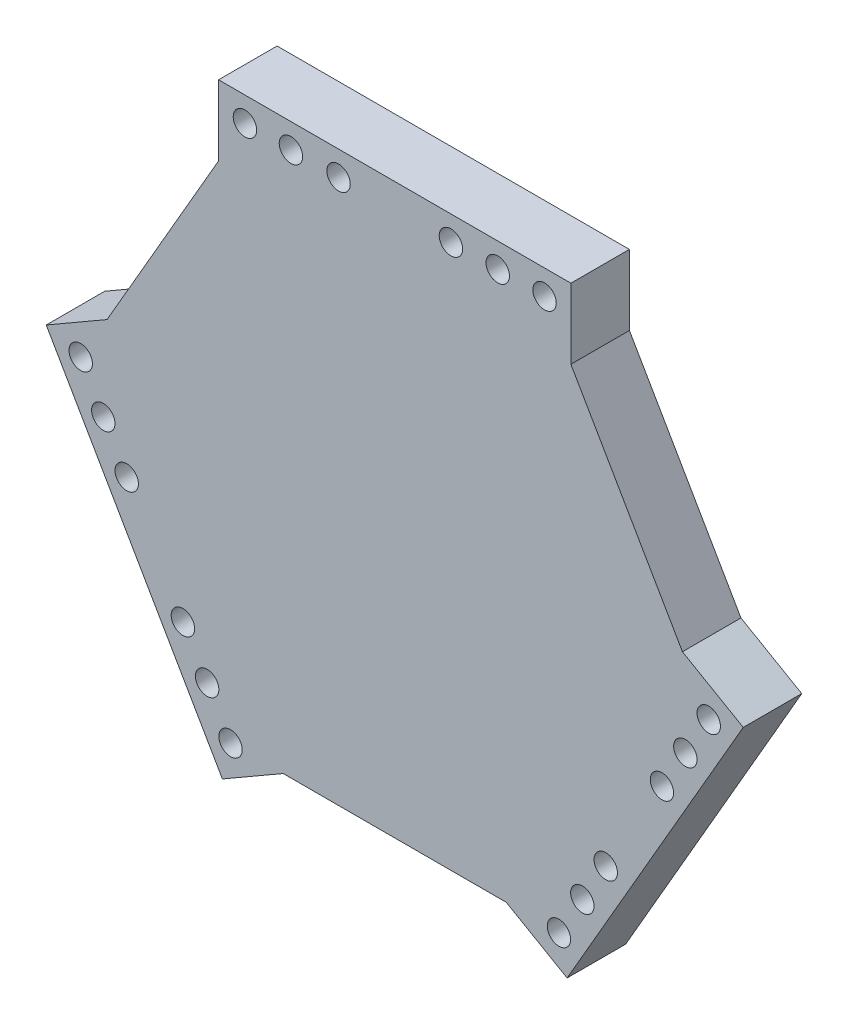
ISO-10303-21;
HEADER;
FILE_DESCRIPTION(('STEP AP214'),'2;1');
FILE_NAME('part.step','',(''),(''),'','','');
FILE_SCHEMA(('AUTOMOTIVE_DESIGN { 1 0 10303 214 1 1 1 1 }'));
ENDSEC;
DATA;
#1=APPLICATION_CONTEXT('core data for automotive mechanical design processes');
#2=APPLICATION_PROTOCOL_DEFINITION('international standard','automotive_design',2000,#1);
#3=PRODUCT_CONTEXT('',#1,'mechanical');
#4=PRODUCT('Part','Part','',(#3));
#5=PRODUCT_RELATED_PRODUCT_CATEGORY('part','',(#4));
#6=PRODUCT_DEFINITION_FORMATION('','',#4);
#7=PRODUCT_DEFINITION_CONTEXT('part definition',#1,'design');
#8=PRODUCT_DEFINITION('design','',#6,#7);
#9=PRODUCT_DEFINITION_SHAPE('','',#8);
#10=(LENGTH_UNIT() NAMED_UNIT(*) SI_UNIT(.MILLI.,.METRE.));
#11=(NAMED_UNIT(*) PLANE_ANGLE_UNIT() SI_UNIT($,.RADIAN.));
#12=(NAMED_UNIT(*) SI_UNIT($,.STERADIAN.) SOLID_ANGLE_UNIT());
#13=UNCERTAINTY_MEASURE_WITH_UNIT(LENGTH_MEASURE(1.E-05),#10,'distance_accuracy_value','');
#14=(GEOMETRIC_REPRESENTATION_CONTEXT(3) GLOBAL_UNCERTAINTY_ASSIGNED_CONTEXT((#13)) GLOBAL_UNIT_ASSIGNED_CONTEXT((#10,
#11,#12)) REPRESENTATION_CONTEXT('',''));
#15=CARTESIAN_POINT('',(0.,0.,0.));
#16=DIRECTION('',(0.,0.,1.));
#17=DIRECTION('',(1.,0.,0.));
#18=AXIS2_PLACEMENT_3D('',#15,#16,#17);
#19=CARTESIAN_POINT('',(14.1462590860232,24.502039474025,10.));
#20=DIRECTION('',(-0.500000000000001,-0.866025403784438,0.));
#21=DIRECTION('',(0.866025403784438,-0.500000000000001,0.));
#22=AXIS2_PLACEMENT_3D('',#19,#20,#21);
#23=PLANE('',#22);
#24=DIRECTION('',(-0.866025403784438,0.500000000000001,0.));
#25=VECTOR('',#24,1.);
#26=CARTESIAN_POINT('',(14.1462590860232,24.502039474025,0.));
#27=LINE('',#26,#25);
#28=CARTESIAN_POINT('',(79.2549746901522,-13.0884950066097,0.));
#29=VERTEX_POINT('',#28);
#30=CARTESIAN_POINT('',(68.862669844739,-7.08849500660971,0.));
#31=VERTEX_POINT('',#30);
#32=EDGE_CURVE('E209',#29,#31,#27,.T.);
#33=ORIENTED_EDGE('',*,*,#32,.T.);
#34=DIRECTION('',(0.,0.,-1.));
#35=VECTOR('',#34,1.);
#36=CARTESIAN_POINT('',(68.862669844739,-7.08849500660971,10.));
#37=LINE('',#36,#35);
#38=CARTESIAN_POINT('',(68.862669844739,-7.08849500660971,10.));
#39=VERTEX_POINT('',#38);
#40=EDGE_CURVE('E11',#39,#31,#37,.T.);
#41=ORIENTED_EDGE('',*,*,#40,.F.);
#42=DIRECTION('',(-0.866025403784438,0.500000000000001,0.));
#43=VECTOR('',#42,1.);
#44=CARTESIAN_POINT('',(14.1462590860232,24.502039474025,10.));
#45=LINE('',#44,#43);
#46=CARTESIAN_POINT('',(79.2549746901522,-13.0884950066097,10.));
#47=VERTEX_POINT('',#46);
#48=EDGE_CURVE('E320',#47,#39,#45,.T.);
#49=ORIENTED_EDGE('',*,*,#48,.F.);
#50=DIRECTION('',(0.,0.,-1.));
#51=VECTOR('',#50,1.);
#52=CARTESIAN_POINT('',(79.2549746901522,-13.0884950066097,10.));
#53=LINE('',#52,#51);
#54=EDGE_CURVE('E196',#47,#29,#53,.T.);
#55=ORIENTED_EDGE('',*,*,#54,.T.);
#56=EDGE_LOOP('',(#33,#41,#49,#55));
#57=FACE_BOUND('',#56,.T.);
#58=ADVANCED_FACE('F33',(#57),#23,.F.);
#59=CARTESIAN_POINT('',(48.5775940083924,28.04628697733,10.));
#60=DIRECTION('',(-0.866025403784436,-0.500000000000004,0.));
#61=DIRECTION('',(0.500000000000004,-0.866025403784436,0.));
#62=AXIS2_PLACEMENT_3D('',#59,#60,#61);
#63=PLANE('',#62);
#64=DIRECTION('',(-0.500000000000004,0.866025403784436,0.));
#65=VECTOR('',#64,1.);
#66=CARTESIAN_POINT('',(48.5775940083924,28.04628697733,0.));
#67=LINE('',#66,#65);
#68=CARTESIAN_POINT('',(49.8026698447388,25.924393385653,0.));
#69=VERTEX_POINT('',#68);
#70=EDGE_CURVE('E212',#31,#69,#67,.T.);
#71=ORIENTED_EDGE('',*,*,#70,.T.);
#72=DIRECTION('',(0.,0.,-1.));
#73=VECTOR('',#72,1.);
#74=CARTESIAN_POINT('',(49.8026698447388,25.924393385653,10.));
#75=LINE('',#74,#73);
#76=CARTESIAN_POINT('',(49.8026698447388,25.924393385653,10.));
#77=VERTEX_POINT('',#76);
#78=EDGE_CURVE('E42',#77,#69,#75,.T.);
#79=ORIENTED_EDGE('',*,*,#78,.F.);
#80=DIRECTION('',(-0.500000000000004,0.866025403784436,0.));
#81=VECTOR('',#80,1.);
#82=CARTESIAN_POINT('',(48.5775940083924,28.04628697733,10.));
#83=LINE('',#82,#81);
#84=EDGE_CURVE('E105',#39,#77,#83,.T.);
#85=ORIENTED_EDGE('',*,*,#84,.F.);
#86=ORIENTED_EDGE('',*,*,#40,.T.);
#87=EDGE_LOOP('',(#71,#79,#85,#86));
#88=FACE_BOUND('',#87,.T.);
#89=ADVANCED_FACE('F302',(#88),#63,.F.);
#90=CARTESIAN_POINT('',(49.8026698447388,0.,10.));
#91=DIRECTION('',(1.,0.,0.));
#92=DIRECTION('',(0.,0.,-1.));
#93=AXIS2_PLACEMENT_3D('',#90,#91,#92);
#94=PLANE('',#93);
#95=DIRECTION('',(0.,-1.,0.));
#96=VECTOR('',#95,1.);
#97=CARTESIAN_POINT('',(49.8026698447388,0.,0.));
#98=LINE('',#97,#96);
#99=CARTESIAN_POINT('',(49.8026698447388,37.924393385653,0.));
#100=VERTEX_POINT('',#99);
#101=EDGE_CURVE('E215',#100,#69,#98,.T.);
#102=ORIENTED_EDGE('',*,*,#101,.F.);
#103=DIRECTION('',(0.,0.,-1.));
#104=VECTOR('',#103,1.);
#105=CARTESIAN_POINT('',(49.8026698447388,37.924393385653,10.));
#106=LINE('',#105,#104);
#107=CARTESIAN_POINT('',(49.8026698447388,37.924393385653,10.));
#108=VERTEX_POINT('',#107);
#109=EDGE_CURVE('E295',#108,#100,#106,.T.);
#110=ORIENTED_EDGE('',*,*,#109,.F.);
#111=DIRECTION('',(0.,-1.,0.));
#112=VECTOR('',#111,1.);
#113=CARTESIAN_POINT('',(49.8026698447388,0.,10.));
#114=LINE('',#113,#112);
#115=EDGE_CURVE('E301',#108,#77,#114,.T.);
#116=ORIENTED_EDGE('',*,*,#115,.T.);
#117=ORIENTED_EDGE('',*,*,#78,.T.);
#118=EDGE_LOOP('',(#102,#110,#116,#117));
#119=FACE_BOUND('',#118,.T.);
#120=ADVANCED_FACE('F299',(#119),#94,.T.);
#121=CARTESIAN_POINT('',(0.,37.924393385653,10.));
#122=DIRECTION('',(0.,1.,0.));
#123=DIRECTION('',(0.,0.,1.));
#124=AXIS2_PLACEMENT_3D('',#121,#122,#123);
#125=PLANE('',#124);
#126=DIRECTION('',(1.,0.,0.));
#127=VECTOR('',#126,1.);
#128=CARTESIAN_POINT('',(0.,37.924393385653,0.));
#129=LINE('',#128,#127);
#130=CARTESIAN_POINT('',(-10.3973301552612,37.924393385653,0.));
#131=VERTEX_POINT('',#130);
#132=EDGE_CURVE('E218',#131,#100,#129,.T.);
#133=ORIENTED_EDGE('',*,*,#132,.F.);
#134=DIRECTION('',(0.,0.,-1.));
#135=VECTOR('',#134,1.);
#136=CARTESIAN_POINT('',(-10.3973301552612,37.924393385653,10.));
#137=LINE('',#136,#135);
#138=CARTESIAN_POINT('',(-10.3973301552612,37.924393385653,10.));
#139=VERTEX_POINT('',#138);
#140=EDGE_CURVE('E293',#139,#131,#137,.T.);
#141=ORIENTED_EDGE('',*,*,#140,.F.);
#142=DIRECTION('',(1.,0.,0.));
#143=VECTOR('',#142,1.);
#144=CARTESIAN_POINT('',(0.,37.924393385653,10.));
#145=LINE('',#144,#143);
#146=EDGE_CURVE('E316',#139,#108,#145,.T.);
#147=ORIENTED_EDGE('',*,*,#146,.T.);
#148=ORIENTED_EDGE('',*,*,#109,.T.);
#149=EDGE_LOOP('',(#133,#141,#147,#148));
#150=FACE_BOUND('',#149,.T.);
#151=ADVANCED_FACE('F312',(#150),#125,.T.);
#152=CARTESIAN_POINT('',(-10.3973301552612,0.,10.));
#153=DIRECTION('',(1.,0.,0.));
#154=DIRECTION('',(0.,1.,0.));
#155=AXIS2_PLACEMENT_3D('',#152,#153,#154);
#156=PLANE('',#155);
#157=DIRECTION('',(0.,-1.,0.));
#158=VECTOR('',#157,1.);
#159=CARTESIAN_POINT('',(-10.3973301552612,0.,0.));
#160=LINE('',#159,#158);
#161=CARTESIAN_POINT('',(-10.3973301552612,25.9243933856528,0.));
#162=VERTEX_POINT('',#161);
#163=EDGE_CURVE('E221',#131,#162,#160,.T.);
#164=ORIENTED_EDGE('',*,*,#163,.T.);
#165=DIRECTION('',(0.,0.,-1.));
#166=VECTOR('',#165,1.);
#167=CARTESIAN_POINT('',(-10.3973301552612,25.9243933856528,10.));
#168=LINE('',#167,#166);
#169=CARTESIAN_POINT('',(-10.3973301552612,25.9243933856528,10.));
#170=VERTEX_POINT('',#169);
#171=EDGE_CURVE('E290',#170,#162,#168,.T.);
#172=ORIENTED_EDGE('',*,*,#171,.F.);
#173=DIRECTION('',(0.,-1.,0.));
#174=VECTOR('',#173,1.);
#175=CARTESIAN_POINT('',(-10.3973301552612,0.,10.));
#176=LINE('',#175,#174);
#177=EDGE_CURVE('E318',#139,#170,#176,.T.);
#178=ORIENTED_EDGE('',*,*,#177,.F.);
#179=ORIENTED_EDGE('',*,*,#140,.T.);
#180=EDGE_LOOP('',(#164,#172,#178,#179));
#181=FACE_BOUND('',#180,.T.);
#182=ADVANCED_FACE('F704',(#181),#156,.F.);
#183=CARTESIAN_POINT('',(-19.0235892412842,10.9832743694082,10.));
#184=DIRECTION('',(0.86602540378444,-0.499999999999998,0.));
#185=DIRECTION('',(0.499999999999998,0.86602540378444,0.));
#186=AXIS2_PLACEMENT_3D('',#183,#184,#185);
#187=PLANE('',#186);
#188=DIRECTION('',(-0.499999999999998,-0.86602540378444,0.));
#189=VECTOR('',#188,1.);
#190=CARTESIAN_POINT('',(-19.0235892412842,10.9832743694082,0.));
#191=LINE('',#190,#189);
#192=CARTESIAN_POINT('',(-29.457330155261,-7.08849500660985,0.));
#193=VERTEX_POINT('',#192);
#194=EDGE_CURVE('E223',#162,#193,#191,.T.);
#195=ORIENTED_EDGE('',*,*,#194,.T.);
#196=DIRECTION('',(0.,0.,-1.));
#197=VECTOR('',#196,1.);
#198=CARTESIAN_POINT('',(-29.457330155261,-7.08849500660985,10.));
#199=LINE('',#198,#197);
#200=CARTESIAN_POINT('',(-29.457330155261,-7.08849500660985,10.));
#201=VERTEX_POINT('',#200);
#202=EDGE_CURVE('E288',#201,#193,#199,.T.);
#203=ORIENTED_EDGE('',*,*,#202,.F.);
#204=DIRECTION('',(-0.499999999999998,-0.86602540378444,0.));
#205=VECTOR('',#204,1.);
#206=CARTESIAN_POINT('',(-19.0235892412842,10.9832743694082,10.));
#207=LINE('',#206,#205);
#208=EDGE_CURVE('E325',#170,#201,#207,.T.);
#209=ORIENTED_EDGE('',*,*,#208,.F.);
#210=ORIENTED_EDGE('',*,*,#171,.T.);
#211=EDGE_LOOP('',(#195,#203,#209,#210));
#212=FACE_BOUND('',#211,.T.);
#213=ADVANCED_FACE('F695',(#212),#187,.F.);
#214=CARTESIAN_POINT('',(-4.29492416365385,7.43902686610355,10.));
#215=DIRECTION('',(-0.500000000000009,0.866025403784433,0.));
#216=DIRECTION('',(-0.866025403784433,-0.500000000000009,0.));
#217=AXIS2_PLACEMENT_3D('',#214,#215,#216);
#218=PLANE('',#217);
#219=DIRECTION('',(0.866025403784433,0.500000000000009,0.));
#220=VECTOR('',#219,1.);
#221=CARTESIAN_POINT('',(-4.29492416365385,7.43902686610355,0.));
#222=LINE('',#221,#220);
#223=CARTESIAN_POINT('',(-39.8496350006742,-13.08849500661,0.));
#224=VERTEX_POINT('',#223);
#225=EDGE_CURVE('E226',#224,#193,#222,.T.);
#226=ORIENTED_EDGE('',*,*,#225,.F.);
#227=DIRECTION('',(0.,0.,-1.));
#228=VECTOR('',#227,1.);
#229=CARTESIAN_POINT('',(-39.8496350006742,-13.08849500661,10.));
#230=LINE('',#229,#228);
#231=CARTESIAN_POINT('',(-39.8496350006742,-13.08849500661,10.));
#232=VERTEX_POINT('',#231);
#233=EDGE_CURVE('E286',#232,#224,#230,.T.);
#234=ORIENTED_EDGE('',*,*,#233,.F.);
#235=DIRECTION('',(0.866025403784433,0.500000000000009,0.));
#236=VECTOR('',#235,1.);
#237=CARTESIAN_POINT('',(-4.29492416365385,7.43902686610355,10.));
#238=LINE('',#237,#236);
#239=EDGE_CURVE('E327',#232,#201,#238,.T.);
#240=ORIENTED_EDGE('',*,*,#239,.T.);
#241=ORIENTED_EDGE('',*,*,#202,.T.);
#242=EDGE_LOOP('',(#226,#234,#240,#241));
#243=FACE_BOUND('',#242,.T.);
#244=ADVANCED_FACE('F686',(#243),#218,.T.);
#245=CARTESIAN_POINT('',(-35.5547108370204,-20.5275218727134,10.));
#246=DIRECTION('',(-0.866025403784434,-0.500000000000007,0.));
#247=DIRECTION('',(0.500000000000007,-0.866025403784435,0.));
#248=AXIS2_PLACEMENT_3D('',#245,#246,#247);
#249=PLANE('',#248);
#250=DIRECTION('',(-0.500000000000007,0.866025403784435,0.));
#251=VECTOR('',#250,1.);
#252=CARTESIAN_POINT('',(-35.5547108370204,-20.5275218727134,0.));
#253=LINE('',#252,#251);
#254=CARTESIAN_POINT('',(-9.74963500067373,-65.223224314433,0.));
#255=VERTEX_POINT('',#254);
#256=EDGE_CURVE('E229',#255,#224,#253,.T.);
#257=ORIENTED_EDGE('',*,*,#256,.F.);
#258=DIRECTION('',(0.,0.,-1.));
#259=VECTOR('',#258,1.);
#260=CARTESIAN_POINT('',(-9.74963500067373,-65.223224314433,10.));
#261=LINE('',#260,#259);
#262=CARTESIAN_POINT('',(-9.74963500067373,-65.223224314433,10.));
#263=VERTEX_POINT('',#262);
#264=EDGE_CURVE('E284',#263,#255,#261,.T.);
#265=ORIENTED_EDGE('',*,*,#264,.F.);
#266=DIRECTION('',(-0.500000000000007,0.866025403784435,0.));
#267=VECTOR('',#266,1.);
#268=CARTESIAN_POINT('',(-35.5547108370204,-20.5275218727134,10.));
#269=LINE('',#268,#267);
#270=EDGE_CURVE('E330',#263,#232,#269,.T.);
#271=ORIENTED_EDGE('',*,*,#270,.T.);
#272=ORIENTED_EDGE('',*,*,#233,.T.);
#273=EDGE_LOOP('',(#257,#265,#271,#272));
#274=FACE_BOUND('',#273,.T.);
#275=ADVANCED_FACE('F678',(#274),#249,.T.);
#276=CARTESIAN_POINT('',(25.8050758363467,-44.6957024417195,10.));
#277=DIRECTION('',(0.500000000000007,-0.866025403784435,0.));
#278=DIRECTION('',(0.866025403784435,0.500000000000007,0.));
#279=AXIS2_PLACEMENT_3D('',#276,#277,#278);
#280=PLANE('',#279);
#281=DIRECTION('',(-0.866025403784435,-0.500000000000007,0.));
#282=VECTOR('',#281,1.);
#283=CARTESIAN_POINT('',(25.8050758363467,-44.6957024417195,0.));
#284=LINE('',#283,#282);
#285=CARTESIAN_POINT('',(0.642669844739498,-59.2232243144329,0.));
#286=VERTEX_POINT('',#285);
#287=EDGE_CURVE('E232',#286,#255,#284,.T.);
#288=ORIENTED_EDGE('',*,*,#287,.F.);
#289=DIRECTION('',(0.,0.,-1.));
#290=VECTOR('',#289,1.);
#291=CARTESIAN_POINT('',(0.642669844739498,-59.2232243144329,10.));
#292=LINE('',#291,#290);
#293=CARTESIAN_POINT('',(0.642669844739498,-59.2232243144329,10.));
#294=VERTEX_POINT('',#293);
#295=EDGE_CURVE('E146',#294,#286,#292,.T.);
#296=ORIENTED_EDGE('',*,*,#295,.F.);
#297=DIRECTION('',(-0.866025403784435,-0.500000000000007,0.));
#298=VECTOR('',#297,1.);
#299=CARTESIAN_POINT('',(25.8050758363467,-44.6957024417195,10.));
#300=LINE('',#299,#298);
#301=EDGE_CURVE('E139',#294,#263,#300,.T.);
#302=ORIENTED_EDGE('',*,*,#301,.T.);
#303=ORIENTED_EDGE('',*,*,#264,.T.);
#304=EDGE_LOOP('',(#288,#296,#302,#303));
#305=FACE_BOUND('',#304,.T.);
#306=ADVANCED_FACE('F334',(#305),#280,.T.);
#307=CARTESIAN_POINT('',(0.,-59.2232243144329,10.));
#308=DIRECTION('',(0.,1.,0.));
#309=DIRECTION('',(0.,0.,1.));
#310=AXIS2_PLACEMENT_3D('',#307,#308,#309);
#311=PLANE('',#310);
#312=DIRECTION('',(1.,0.,0.));
#313=VECTOR('',#312,1.);
#314=CARTESIAN_POINT('',(0.,-59.2232243144329,0.));
#315=LINE('',#314,#313);
#316=CARTESIAN_POINT('',(38.7626698447389,-59.2232243144329,0.));
#317=VERTEX_POINT('',#316);
#318=EDGE_CURVE('E145',#286,#317,#315,.T.);
#319=ORIENTED_EDGE('',*,*,#318,.T.);
#320=DIRECTION('',(0.,0.,-1.));
#321=VECTOR('',#320,1.);
#322=CARTESIAN_POINT('',(38.7626698447389,-59.2232243144329,10.));
#323=LINE('',#322,#321);
#324=CARTESIAN_POINT('',(38.7626698447389,-59.2232243144329,10.));
#325=VERTEX_POINT('',#324);
#326=EDGE_CURVE('E142',#325,#317,#323,.T.);
#327=ORIENTED_EDGE('',*,*,#326,.F.);
#328=DIRECTION('',(1.,0.,0.));
#329=VECTOR('',#328,1.);
#330=CARTESIAN_POINT('',(0.,-59.2232243144329,10.));
#331=LINE('',#330,#329);
#332=EDGE_CURVE('E131',#294,#325,#331,.T.);
#333=ORIENTED_EDGE('',*,*,#332,.F.);
#334=ORIENTED_EDGE('',*,*,#295,.T.);
#335=EDGE_LOOP('',(#319,#327,#333,#334));
#336=FACE_BOUND('',#335,.T.);
#337=ADVANCED_FACE('F143',(#336),#311,.F.);
#338=CARTESIAN_POINT('',(-15.9537409139768,-27.6326898337981,10.));
#339=DIRECTION('',(0.500000000000001,0.866025403784438,0.));
#340=DIRECTION('',(-0.866025403784438,0.500000000000001,0.));
#341=AXIS2_PLACEMENT_3D('',#338,#339,#340);
#342=PLANE('',#341);
#343=DIRECTION('',(0.866025403784438,-0.500000000000001,0.));
#344=VECTOR('',#343,1.);
#345=CARTESIAN_POINT('',(-15.9537409139768,-27.6326898337981,0.));
#346=LINE('',#345,#344);
#347=CARTESIAN_POINT('',(49.1549746901523,-65.223224314433,0.));
#348=VERTEX_POINT('',#347);
#349=EDGE_CURVE('E91',#317,#348,#346,.T.);
#350=ORIENTED_EDGE('',*,*,#349,.T.);
#351=DIRECTION('',(0.,0.,-1.));
#352=VECTOR('',#351,1.);
#353=CARTESIAN_POINT('',(49.1549746901523,-65.223224314433,10.));
#354=LINE('',#353,#352);
#355=CARTESIAN_POINT('',(49.1549746901523,-65.223224314433,10.));
#356=VERTEX_POINT('',#355);
#357=EDGE_CURVE('E147',#356,#348,#354,.T.);
#358=ORIENTED_EDGE('',*,*,#357,.F.);
#359=DIRECTION('',(0.866025403784438,-0.500000000000001,0.));
#360=VECTOR('',#359,1.);
#361=CARTESIAN_POINT('',(-15.9537409139768,-27.6326898337981,10.));
#362=LINE('',#361,#360);
#363=EDGE_CURVE('E136',#325,#356,#362,.T.);
#364=ORIENTED_EDGE('',*,*,#363,.F.);
#365=ORIENTED_EDGE('',*,*,#326,.T.);
#366=EDGE_LOOP('',(#350,#358,#364,#365));
#367=FACE_BOUND('',#366,.T.);
#368=ADVANCED_FACE('F149',(#367),#342,.F.);
#369=CARTESIAN_POINT('',(-12.3573301552616,-52.2950210841579,10.));
#370=DIRECTION('',(0.,0.,-1.));
#371=DIRECTION('',(-1.,0.,0.));
#372=AXIS2_PLACEMENT_3D('',#369,#370,#371);
#373=CYLINDRICAL_SURFACE('',#372,2.00000000000076);
#374=CARTESIAN_POINT('',(-12.3573301552616,-52.2950210841579,10.));
#375=DIRECTION('',(0.,0.,1.));
#376=DIRECTION('',(1.,0.,0.));
#377=AXIS2_PLACEMENT_3D('',#374,#375,#376);
#378=CIRCLE('',#377,2.00000000000076);
#379=CARTESIAN_POINT('',(-10.3573301552608,-52.2950210841579,10.));
#380=VERTEX_POINT('',#379);
#381=EDGE_CURVE('E190',#380,#380,#378,.T.);
#382=ORIENTED_EDGE('',*,*,#381,.T.);
#383=EDGE_LOOP('',(#382));
#384=FACE_BOUND('',#383,.T.);
#385=CARTESIAN_POINT('',(-12.3573301552616,-52.2950210841579,0.));
#386=DIRECTION('',(0.,0.,1.));
#387=DIRECTION('',(1.,0.,0.));
#388=AXIS2_PLACEMENT_3D('',#385,#386,#387);
#389=CIRCLE('',#388,2.00000000000076);
#390=CARTESIAN_POINT('',(-10.3573301552608,-52.2950210841579,0.));
#391=VERTEX_POINT('',#390);
#392=EDGE_CURVE('E274',#391,#391,#389,.T.);
#393=ORIENTED_EDGE('',*,*,#392,.F.);
#394=EDGE_LOOP('',(#393));
#395=FACE_BOUND('',#394,.T.);
#396=ADVANCED_FACE('F396',(#384,#395),#373,.F.);
#397=CARTESIAN_POINT('',(-16.4976707976515,-45.3668178538819,10.));
#398=DIRECTION('',(0.,0.,-1.));
#399=DIRECTION('',(-1.,0.,0.));
#400=AXIS2_PLACEMENT_3D('',#397,#398,#399);
#401=CYLINDRICAL_SURFACE('',#400,2.);
#402=CARTESIAN_POINT('',(-16.4976707976515,-45.3668178538819,10.));
#403=DIRECTION('',(0.,0.,1.));
#404=DIRECTION('',(1.,0.,0.));
#405=AXIS2_PLACEMENT_3D('',#402,#403,#404);
#406=CIRCLE('',#405,2.);
#407=CARTESIAN_POINT('',(-14.4976707976515,-45.3668178538819,10.));
#408=VERTEX_POINT('',#407);
#409=EDGE_CURVE('E187',#408,#408,#406,.T.);
#410=ORIENTED_EDGE('',*,*,#409,.T.);
#411=EDGE_LOOP('',(#410));
#412=FACE_BOUND('',#411,.T.);
#413=CARTESIAN_POINT('',(-16.4976707976515,-45.3668178538819,0.));
#414=DIRECTION('',(0.,0.,1.));
#415=DIRECTION('',(1.,0.,0.));
#416=AXIS2_PLACEMENT_3D('',#413,#414,#415);
#417=CIRCLE('',#416,2.);
#418=CARTESIAN_POINT('',(-14.4976707976515,-45.3668178538819,0.));
#419=VERTEX_POINT('',#418);
#420=EDGE_CURVE('E271',#419,#419,#417,.T.);
#421=ORIENTED_EDGE('',*,*,#420,.F.);
#422=EDGE_LOOP('',(#421));
#423=FACE_BOUND('',#422,.T.);
#424=ADVANCED_FACE('F399',(#412,#423),#401,.F.);
#425=CARTESIAN_POINT('',(-26.0976707976517,-28.7391301012208,10.));
#426=DIRECTION('',(0.,0.,-1.));
#427=DIRECTION('',(-1.,0.,0.));
#428=AXIS2_PLACEMENT_3D('',#425,#426,#427);
#429=CYLINDRICAL_SURFACE('',#428,2.);
#430=CARTESIAN_POINT('',(-26.0976707976517,-28.7391301012208,10.));
#431=DIRECTION('',(0.,0.,1.));
#432=DIRECTION('',(1.,0.,0.));
#433=AXIS2_PLACEMENT_3D('',#430,#431,#432);
#434=CIRCLE('',#433,2.);
#435=CARTESIAN_POINT('',(-24.0976707976517,-28.7391301012208,10.));
#436=VERTEX_POINT('',#435);
#437=EDGE_CURVE('E184',#436,#436,#434,.T.);
#438=ORIENTED_EDGE('',*,*,#437,.T.);
#439=EDGE_LOOP('',(#438));
#440=FACE_BOUND('',#439,.T.);
#441=CARTESIAN_POINT('',(-26.0976707976517,-28.7391301012208,0.));
#442=DIRECTION('',(0.,0.,1.));
#443=DIRECTION('',(1.,0.,0.));
#444=AXIS2_PLACEMENT_3D('',#441,#442,#443);
#445=CIRCLE('',#444,2.);
#446=CARTESIAN_POINT('',(-24.0976707976517,-28.7391301012208,0.));
#447=VERTEX_POINT('',#446);
#448=EDGE_CURVE('E268',#447,#447,#445,.T.);
#449=ORIENTED_EDGE('',*,*,#448,.F.);
#450=EDGE_LOOP('',(#449));
#451=FACE_BOUND('',#450,.T.);
#452=ADVANCED_FACE('F403',(#440,#451),#429,.F.);
#453=CARTESIAN_POINT('',(-30.0976707976518,-21.8109268709454,10.));
#454=DIRECTION('',(0.,0.,-1.));
#455=DIRECTION('',(-1.,0.,0.));
#456=AXIS2_PLACEMENT_3D('',#453,#454,#455);
#457=CYLINDRICAL_SURFACE('',#456,2.);
#458=CARTESIAN_POINT('',(-30.0976707976518,-21.8109268709454,10.));
#459=DIRECTION('',(0.,0.,1.));
#460=DIRECTION('',(1.,0.,0.));
#461=AXIS2_PLACEMENT_3D('',#458,#459,#460);
#462=CIRCLE('',#461,2.);
#463=CARTESIAN_POINT('',(-28.0976707976518,-21.8109268709454,10.));
#464=VERTEX_POINT('',#463);
#465=EDGE_CURVE('E181',#464,#464,#462,.T.);
#466=ORIENTED_EDGE('',*,*,#465,.T.);
#467=EDGE_LOOP('',(#466));
#468=FACE_BOUND('',#467,.T.);
#469=CARTESIAN_POINT('',(-30.0976707976518,-21.8109268709454,0.));
#470=DIRECTION('',(0.,0.,1.));
#471=DIRECTION('',(1.,0.,0.));
#472=AXIS2_PLACEMENT_3D('',#469,#470,#471);
#473=CIRCLE('',#472,2.);
#474=CARTESIAN_POINT('',(-28.0976707976518,-21.8109268709454,0.));
#475=VERTEX_POINT('',#474);
#476=EDGE_CURVE('E265',#475,#475,#473,.T.);
#477=ORIENTED_EDGE('',*,*,#476,.F.);
#478=EDGE_LOOP('',(#477));
#479=FACE_BOUND('',#478,.T.);
#480=ADVANCED_FACE('F407',(#468,#479),#457,.F.);
#481=CARTESIAN_POINT('',(-33.9573301552611,-14.8827236406699,10.));
#482=DIRECTION('',(0.,0.,-1.));
#483=DIRECTION('',(-1.,0.,0.));
#484=AXIS2_PLACEMENT_3D('',#481,#482,#483);
#485=CYLINDRICAL_SURFACE('',#484,2.);
#486=CARTESIAN_POINT('',(-33.9573301552611,-14.8827236406699,10.));
#487=DIRECTION('',(0.,0.,1.));
#488=DIRECTION('',(1.,0.,0.));
#489=AXIS2_PLACEMENT_3D('',#486,#487,#488);
#490=CIRCLE('',#489,2.);
#491=CARTESIAN_POINT('',(-31.9573301552611,-14.8827236406699,10.));
#492=VERTEX_POINT('',#491);
#493=EDGE_CURVE('E178',#492,#492,#490,.T.);
#494=ORIENTED_EDGE('',*,*,#493,.T.);
#495=EDGE_LOOP('',(#494));
#496=FACE_BOUND('',#495,.T.);
#497=CARTESIAN_POINT('',(-33.9573301552611,-14.8827236406699,0.));
#498=DIRECTION('',(0.,0.,1.));
#499=DIRECTION('',(1.,0.,0.));
#500=AXIS2_PLACEMENT_3D('',#497,#498,#499);
#501=CIRCLE('',#500,2.);
#502=CARTESIAN_POINT('',(-31.9573301552611,-14.8827236406699,0.));
#503=VERTEX_POINT('',#502);
#504=EDGE_CURVE('E262',#503,#503,#501,.T.);
#505=ORIENTED_EDGE('',*,*,#504,.F.);
#506=EDGE_LOOP('',(#505));
#507=FACE_BOUND('',#506,.T.);
#508=ADVANCED_FACE('F411',(#496,#507),#485,.F.);
#509=CARTESIAN_POINT('',(45.3026698447388,33.7186220197128,10.));
#510=DIRECTION('',(0.,0.,-1.));
#511=DIRECTION('',(-1.,0.,0.));
#512=AXIS2_PLACEMENT_3D('',#509,#510,#511);
#513=CYLINDRICAL_SURFACE('',#512,2.);
#514=CARTESIAN_POINT('',(45.3026698447388,33.7186220197128,10.));
#515=DIRECTION('',(0.,0.,1.));
#516=DIRECTION('',(1.,0.,0.));
#517=AXIS2_PLACEMENT_3D('',#514,#515,#516);
#518=CIRCLE('',#517,2.);
#519=CARTESIAN_POINT('',(47.3026698447388,33.7186220197128,10.));
#520=VERTEX_POINT('',#519);
#521=EDGE_CURVE('E175',#520,#520,#518,.T.);
#522=ORIENTED_EDGE('',*,*,#521,.T.);
#523=EDGE_LOOP('',(#522));
#524=FACE_BOUND('',#523,.T.);
#525=CARTESIAN_POINT('',(45.3026698447388,33.7186220197128,0.));
#526=DIRECTION('',(0.,0.,1.));
#527=DIRECTION('',(1.,0.,0.));
#528=AXIS2_PLACEMENT_3D('',#525,#526,#527);
#529=CIRCLE('',#528,2.);
#530=CARTESIAN_POINT('',(47.3026698447388,33.7186220197128,0.));
#531=VERTEX_POINT('',#530);
#532=EDGE_CURVE('E259',#531,#531,#529,.T.);
#533=ORIENTED_EDGE('',*,*,#532,.F.);
#534=EDGE_LOOP('',(#533));
#535=FACE_BOUND('',#534,.T.);
#536=ADVANCED_FACE('F415',(#524,#535),#513,.F.);
#537=CARTESIAN_POINT('',(51.7626698447392,-52.2950210841575,10.));
#538=DIRECTION('',(0.,0.,-1.));
#539=DIRECTION('',(-1.,0.,0.));
#540=AXIS2_PLACEMENT_3D('',#537,#538,#539);
#541=CYLINDRICAL_SURFACE('',#540,2.);
#542=CARTESIAN_POINT('',(51.7626698447392,-52.2950210841575,10.));
#543=DIRECTION('',(0.,0.,1.));
#544=DIRECTION('',(1.,0.,0.));
#545=AXIS2_PLACEMENT_3D('',#542,#543,#544);
#546=CIRCLE('',#545,2.);
#547=CARTESIAN_POINT('',(53.7626698447392,-52.2950210841575,10.));
#548=VERTEX_POINT('',#547);
#549=EDGE_CURVE('E172',#548,#548,#546,.T.);
#550=ORIENTED_EDGE('',*,*,#549,.T.);
#551=EDGE_LOOP('',(#550));
#552=FACE_BOUND('',#551,.T.);
#553=CARTESIAN_POINT('',(51.7626698447392,-52.2950210841575,0.));
#554=DIRECTION('',(0.,0.,1.));
#555=DIRECTION('',(1.,0.,0.));
#556=AXIS2_PLACEMENT_3D('',#553,#554,#555);
#557=CIRCLE('',#556,2.);
#558=CARTESIAN_POINT('',(53.7626698447392,-52.2950210841575,0.));
#559=VERTEX_POINT('',#558);
#560=EDGE_CURVE('E256',#559,#559,#557,.T.);
#561=ORIENTED_EDGE('',*,*,#560,.F.);
#562=EDGE_LOOP('',(#561));
#563=FACE_BOUND('',#562,.T.);
#564=ADVANCED_FACE('F419',(#552,#563),#541,.F.);
#565=CARTESIAN_POINT('',(-5.89733015526116,33.7186220197128,10.));
#566=DIRECTION('',(0.,0.,-1.));
#567=DIRECTION('',(-1.,0.,0.));
#568=AXIS2_PLACEMENT_3D('',#565,#566,#567);
#569=CYLINDRICAL_SURFACE('',#568,2.);
#570=CARTESIAN_POINT('',(-5.89733015526116,33.7186220197128,10.));
#571=DIRECTION('',(0.,0.,1.));
#572=DIRECTION('',(1.,0.,0.));
#573=AXIS2_PLACEMENT_3D('',#570,#571,#572);
#574=CIRCLE('',#573,2.);
#575=CARTESIAN_POINT('',(-3.89733015526116,33.7186220197128,10.));
#576=VERTEX_POINT('',#575);
#577=EDGE_CURVE('E169',#576,#576,#574,.T.);
#578=ORIENTED_EDGE('',*,*,#577,.T.);
#579=EDGE_LOOP('',(#578));
#580=FACE_BOUND('',#579,.T.);
#581=CARTESIAN_POINT('',(-5.89733015526116,33.7186220197128,0.));
#582=DIRECTION('',(0.,0.,1.));
#583=DIRECTION('',(1.,0.,0.));
#584=AXIS2_PLACEMENT_3D('',#581,#582,#583);
#585=CIRCLE('',#584,2.);
#586=CARTESIAN_POINT('',(-3.89733015526116,33.7186220197128,0.));
#587=VERTEX_POINT('',#586);
#588=EDGE_CURVE('E253',#587,#587,#585,.T.);
#589=ORIENTED_EDGE('',*,*,#588,.F.);
#590=EDGE_LOOP('',(#589));
#591=FACE_BOUND('',#590,.T.);
#592=ADVANCED_FACE('F423',(#580,#591),#569,.F.);
#593=CARTESIAN_POINT('',(1.96232920234802,33.7186220197129,10.));
#594=DIRECTION('',(0.,0.,-1.));
#595=DIRECTION('',(-1.,0.,0.));
#596=AXIS2_PLACEMENT_3D('',#593,#594,#595);
#597=CYLINDRICAL_SURFACE('',#596,2.);
#598=CARTESIAN_POINT('',(1.96232920234802,33.7186220197129,10.));
#599=DIRECTION('',(0.,0.,1.));
#600=DIRECTION('',(1.,0.,0.));
#601=AXIS2_PLACEMENT_3D('',#598,#599,#600);
#602=CIRCLE('',#601,2.);
#603=CARTESIAN_POINT('',(3.96232920234802,33.7186220197129,10.));
#604=VERTEX_POINT('',#603);
#605=EDGE_CURVE('E166',#604,#604,#602,.T.);
#606=ORIENTED_EDGE('',*,*,#605,.T.);
#607=EDGE_LOOP('',(#606));
#608=FACE_BOUND('',#607,.T.);
#609=CARTESIAN_POINT('',(1.96232920234802,33.7186220197129,0.));
#610=DIRECTION('',(0.,0.,1.));
#611=DIRECTION('',(1.,0.,0.));
#612=AXIS2_PLACEMENT_3D('',#609,#610,#611);
#613=CIRCLE('',#612,2.);
#614=CARTESIAN_POINT('',(3.96232920234802,33.7186220197129,0.));
#615=VERTEX_POINT('',#614);
#616=EDGE_CURVE('E250',#615,#615,#613,.T.);
#617=ORIENTED_EDGE('',*,*,#616,.F.);
#618=EDGE_LOOP('',(#617));
#619=FACE_BOUND('',#618,.T.);
#620=ADVANCED_FACE('F427',(#608,#619),#597,.F.);
#621=CARTESIAN_POINT('',(10.1026698447388,33.7186220197128,10.));
#622=DIRECTION('',(0.,0.,-1.));
#623=DIRECTION('',(-1.,0.,0.));
#624=AXIS2_PLACEMENT_3D('',#621,#622,#623);
#625=CYLINDRICAL_SURFACE('',#624,2.);
#626=CARTESIAN_POINT('',(10.1026698447388,33.7186220197128,10.));
#627=DIRECTION('',(0.,0.,1.));
#628=DIRECTION('',(1.,0.,0.));
#629=AXIS2_PLACEMENT_3D('',#626,#627,#628);
#630=CIRCLE('',#629,2.);
#631=CARTESIAN_POINT('',(12.1026698447388,33.7186220197128,10.));
#632=VERTEX_POINT('',#631);
#633=EDGE_CURVE('E163',#632,#632,#630,.T.);
#634=ORIENTED_EDGE('',*,*,#633,.T.);
#635=EDGE_LOOP('',(#634));
#636=FACE_BOUND('',#635,.T.);
#637=CARTESIAN_POINT('',(10.1026698447388,33.7186220197128,0.));
#638=DIRECTION('',(0.,0.,1.));
#639=DIRECTION('',(1.,0.,0.));
#640=AXIS2_PLACEMENT_3D('',#637,#638,#639);
#641=CIRCLE('',#640,2.);
#642=CARTESIAN_POINT('',(12.1026698447388,33.7186220197128,0.));
#643=VERTEX_POINT('',#642);
#644=EDGE_CURVE('E247',#643,#643,#641,.T.);
#645=ORIENTED_EDGE('',*,*,#644,.F.);
#646=EDGE_LOOP('',(#645));
#647=FACE_BOUND('',#646,.T.);
#648=ADVANCED_FACE('F431',(#636,#647),#625,.F.);
#649=CARTESIAN_POINT('',(29.3026698447388,33.7186220197128,10.));
#650=DIRECTION('',(0.,0.,-1.));
#651=DIRECTION('',(-1.,0.,0.));
#652=AXIS2_PLACEMENT_3D('',#649,#650,#651);
#653=CYLINDRICAL_SURFACE('',#652,2.);
#654=CARTESIAN_POINT('',(29.3026698447388,33.7186220197128,10.));
#655=DIRECTION('',(0.,0.,1.));
#656=DIRECTION('',(1.,0.,0.));
#657=AXIS2_PLACEMENT_3D('',#654,#655,#656);
#658=CIRCLE('',#657,2.);
#659=CARTESIAN_POINT('',(31.3026698447388,33.7186220197128,10.));
#660=VERTEX_POINT('',#659);
#661=EDGE_CURVE('E160',#660,#660,#658,.T.);
#662=ORIENTED_EDGE('',*,*,#661,.T.);
#663=EDGE_LOOP('',(#662));
#664=FACE_BOUND('',#663,.T.);
#665=CARTESIAN_POINT('',(29.3026698447388,33.7186220197128,0.));
#666=DIRECTION('',(0.,0.,1.));
#667=DIRECTION('',(1.,0.,0.));
#668=AXIS2_PLACEMENT_3D('',#665,#666,#667);
#669=CIRCLE('',#668,2.);
#670=CARTESIAN_POINT('',(31.3026698447388,33.7186220197128,0.));
#671=VERTEX_POINT('',#670);
#672=EDGE_CURVE('E244',#671,#671,#669,.T.);
#673=ORIENTED_EDGE('',*,*,#672,.F.);
#674=EDGE_LOOP('',(#673));
#675=FACE_BOUND('',#674,.T.);
#676=ADVANCED_FACE('F435',(#664,#675),#653,.F.);
#677=CARTESIAN_POINT('',(37.3026698447388,33.7186220197128,10.));
#678=DIRECTION('',(0.,0.,-1.));
#679=DIRECTION('',(-1.,0.,0.));
#680=AXIS2_PLACEMENT_3D('',#677,#678,#679);
#681=CYLINDRICAL_SURFACE('',#680,2.);
#682=CARTESIAN_POINT('',(37.3026698447388,33.7186220197128,10.));
#683=DIRECTION('',(0.,0.,1.));
#684=DIRECTION('',(1.,0.,0.));
#685=AXIS2_PLACEMENT_3D('',#682,#683,#684);
#686=CIRCLE('',#685,2.);
#687=CARTESIAN_POINT('',(39.3026698447388,33.7186220197128,10.));
#688=VERTEX_POINT('',#687);
#689=EDGE_CURVE('E157',#688,#688,#686,.T.);
#690=ORIENTED_EDGE('',*,*,#689,.T.);
#691=EDGE_LOOP('',(#690));
#692=FACE_BOUND('',#691,.T.);
#693=CARTESIAN_POINT('',(37.3026698447388,33.7186220197128,0.));
#694=DIRECTION('',(0.,0.,1.));
#695=DIRECTION('',(1.,0.,0.));
#696=AXIS2_PLACEMENT_3D('',#693,#694,#695);
#697=CIRCLE('',#696,2.);
#698=CARTESIAN_POINT('',(39.3026698447388,33.7186220197128,0.));
#699=VERTEX_POINT('',#698);
#700=EDGE_CURVE('E241',#699,#699,#697,.T.);
#701=ORIENTED_EDGE('',*,*,#700,.F.);
#702=EDGE_LOOP('',(#701));
#703=FACE_BOUND('',#702,.T.);
#704=ADVANCED_FACE('F350',(#692,#703),#681,.F.);
#705=CARTESIAN_POINT('',(47.7626698447393,-59.2232243144329,10.));
#706=DIRECTION('',(0.,0.,-1.));
#707=DIRECTION('',(-1.,0.,0.));
#708=AXIS2_PLACEMENT_3D('',#705,#706,#707);
#709=CYLINDRICAL_SURFACE('',#708,2.00000000000008);
#710=CARTESIAN_POINT('',(47.7626698447393,-59.2232243144329,10.));
#711=DIRECTION('',(0.,0.,1.));
#712=DIRECTION('',(1.,0.,0.));
#713=AXIS2_PLACEMENT_3D('',#710,#711,#712);
#714=CIRCLE('',#713,2.00000000000008);
#715=CARTESIAN_POINT('',(49.7626698447393,-59.2232243144329,10.));
#716=VERTEX_POINT('',#715);
#717=EDGE_CURVE('E151',#716,#716,#714,.T.);
#718=ORIENTED_EDGE('',*,*,#717,.T.);
#719=EDGE_LOOP('',(#718));
#720=FACE_BOUND('',#719,.T.);
#721=CARTESIAN_POINT('',(47.7626698447393,-59.2232243144329,0.));
#722=DIRECTION('',(0.,0.,1.));
#723=DIRECTION('',(1.,0.,0.));
#724=AXIS2_PLACEMENT_3D('',#721,#722,#723);
#725=CIRCLE('',#724,2.00000000000008);
#726=CARTESIAN_POINT('',(49.7626698447393,-59.2232243144329,0.));
#727=VERTEX_POINT('',#726);
#728=EDGE_CURVE('E238',#727,#727,#725,.T.);
#729=ORIENTED_EDGE('',*,*,#728,.F.);
#730=EDGE_LOOP('',(#729));
#731=FACE_BOUND('',#730,.T.);
#732=ADVANCED_FACE('F341',(#720,#731),#709,.F.);
#733=CARTESIAN_POINT('',(65.1087156041292,-37.5905344806346,10.));
#734=DIRECTION('',(-0.86602540378444,0.499999999999998,0.));
#735=DIRECTION('',(-0.499999999999998,-0.86602540378444,0.));
#736=AXIS2_PLACEMENT_3D('',#733,#734,#735);
#737=PLANE('',#736);
#738=DIRECTION('',(0.499999999999998,0.86602540378444,0.));
#739=VECTOR('',#738,1.);
#740=CARTESIAN_POINT('',(65.1087156041292,-37.5905344806346,0.));
#741=LINE('',#740,#739);
#742=EDGE_CURVE('E97',#348,#29,#741,.T.);
#743=ORIENTED_EDGE('',*,*,#742,.T.);
#744=ORIENTED_EDGE('',*,*,#54,.F.);
#745=DIRECTION('',(0.499999999999998,0.86602540378444,0.));
#746=VECTOR('',#745,1.);
#747=CARTESIAN_POINT('',(65.1087156041292,-37.5905344806346,10.));
#748=LINE('',#747,#746);
#749=EDGE_CURVE('E50',#356,#47,#748,.T.);
#750=ORIENTED_EDGE('',*,*,#749,.F.);
#751=ORIENTED_EDGE('',*,*,#357,.T.);
#752=EDGE_LOOP('',(#743,#744,#750,#751));
#753=FACE_BOUND('',#752,.T.);
#754=ADVANCED_FACE('F338',(#753),#737,.F.);
#755=CARTESIAN_POINT('',(73.3626698447391,-14.8827236406697,10.));
#756=DIRECTION('',(0.,0.,-1.));
#757=DIRECTION('',(-1.,0.,0.));
#758=AXIS2_PLACEMENT_3D('',#755,#756,#757);
#759=CYLINDRICAL_SURFACE('',#758,1.99999999999998);
#760=CARTESIAN_POINT('',(73.3626698447391,-14.8827236406697,10.));
#761=DIRECTION('',(0.,0.,1.));
#762=DIRECTION('',(1.,0.,0.));
#763=AXIS2_PLACEMENT_3D('',#760,#761,#762);
#764=CIRCLE('',#763,1.99999999999998);
#765=CARTESIAN_POINT('',(75.362669844739,-14.8827236406697,10.));
#766=VERTEX_POINT('',#765);
#767=EDGE_CURVE('E777',#766,#766,#764,.T.);
#768=ORIENTED_EDGE('',*,*,#767,.T.);
#769=EDGE_LOOP('',(#768));
#770=FACE_BOUND('',#769,.T.);
#771=CARTESIAN_POINT('',(73.3626698447391,-14.8827236406697,0.));
#772=DIRECTION('',(0.,0.,1.));
#773=DIRECTION('',(1.,0.,0.));
#774=AXIS2_PLACEMENT_3D('',#771,#772,#773);
#775=CIRCLE('',#774,1.99999999999998);
#776=CARTESIAN_POINT('',(75.362669844739,-14.8827236406697,0.));
#777=VERTEX_POINT('',#776);
#778=EDGE_CURVE('E206',#777,#777,#775,.T.);
#779=ORIENTED_EDGE('',*,*,#778,.F.);
#780=EDGE_LOOP('',(#779));
#781=FACE_BOUND('',#780,.T.);
#782=ADVANCED_FACE('F340',(#770,#781),#759,.F.);
#783=CARTESIAN_POINT('',(69.3626698447391,-21.8109268709453,10.));
#784=DIRECTION('',(0.,0.,-1.));
#785=DIRECTION('',(-1.,0.,0.));
#786=AXIS2_PLACEMENT_3D('',#783,#784,#785);
#787=CYLINDRICAL_SURFACE('',#786,2.);
#788=CARTESIAN_POINT('',(69.3626698447391,-21.8109268709453,10.));
#789=DIRECTION('',(0.,0.,1.));
#790=DIRECTION('',(1.,0.,0.));
#791=AXIS2_PLACEMENT_3D('',#788,#789,#790);
#792=CIRCLE('',#791,2.);
#793=CARTESIAN_POINT('',(71.3626698447391,-21.8109268709453,10.));
#794=VERTEX_POINT('',#793);
#795=EDGE_CURVE('E774',#794,#794,#792,.T.);
#796=ORIENTED_EDGE('',*,*,#795,.T.);
#797=EDGE_LOOP('',(#796));
#798=FACE_BOUND('',#797,.T.);
#799=CARTESIAN_POINT('',(69.3626698447391,-21.8109268709453,0.));
#800=DIRECTION('',(0.,0.,1.));
#801=DIRECTION('',(1.,0.,0.));
#802=AXIS2_PLACEMENT_3D('',#799,#800,#801);
#803=CIRCLE('',#802,2.);
#804=CARTESIAN_POINT('',(71.3626698447391,-21.8109268709453,0.));
#805=VERTEX_POINT('',#804);
#806=EDGE_CURVE('E203',#805,#805,#803,.T.);
#807=ORIENTED_EDGE('',*,*,#806,.F.);
#808=EDGE_LOOP('',(#807));
#809=FACE_BOUND('',#808,.T.);
#810=ADVANCED_FACE('F347',(#798,#809),#787,.F.);
#811=CARTESIAN_POINT('',(65.3626698447392,-28.7391301012208,10.));
#812=DIRECTION('',(0.,0.,-1.));
#813=DIRECTION('',(-1.,0.,0.));
#814=AXIS2_PLACEMENT_3D('',#811,#812,#813);
#815=CYLINDRICAL_SURFACE('',#814,2.);
#816=CARTESIAN_POINT('',(65.3626698447392,-28.7391301012208,10.));
#817=DIRECTION('',(0.,0.,1.));
#818=DIRECTION('',(1.,0.,0.));
#819=AXIS2_PLACEMENT_3D('',#816,#817,#818);
#820=CIRCLE('',#819,2.);
#821=CARTESIAN_POINT('',(67.3626698447392,-28.7391301012208,10.));
#822=VERTEX_POINT('',#821);
#823=EDGE_CURVE('E375',#822,#822,#820,.T.);
#824=ORIENTED_EDGE('',*,*,#823,.T.);
#825=EDGE_LOOP('',(#824));
#826=FACE_BOUND('',#825,.T.);
#827=CARTESIAN_POINT('',(65.3626698447392,-28.7391301012208,0.));
#828=DIRECTION('',(0.,0.,1.));
#829=DIRECTION('',(1.,0.,0.));
#830=AXIS2_PLACEMENT_3D('',#827,#828,#829);
#831=CIRCLE('',#830,2.);
#832=CARTESIAN_POINT('',(67.3626698447392,-28.7391301012208,0.));
#833=VERTEX_POINT('',#832);
#834=EDGE_CURVE('E200',#833,#833,#831,.T.);
#835=ORIENTED_EDGE('',*,*,#834,.F.);
#836=EDGE_LOOP('',(#835));
#837=FACE_BOUND('',#836,.T.);
#838=ADVANCED_FACE('F363',(#826,#837),#815,.F.);
#839=CARTESIAN_POINT('',(55.7626698447391,-45.366817853882,10.));
#840=DIRECTION('',(0.,0.,-1.));
#841=DIRECTION('',(-1.,0.,0.));
#842=AXIS2_PLACEMENT_3D('',#839,#840,#841);
#843=CYLINDRICAL_SURFACE('',#842,2.);
#844=CARTESIAN_POINT('',(55.7626698447391,-45.366817853882,10.));
#845=DIRECTION('',(0.,0.,1.));
#846=DIRECTION('',(1.,0.,0.));
#847=AXIS2_PLACEMENT_3D('',#844,#845,#846);
#848=CIRCLE('',#847,2.);
#849=CARTESIAN_POINT('',(57.7626698447391,-45.366817853882,10.));
#850=VERTEX_POINT('',#849);
#851=EDGE_CURVE('E280',#850,#850,#848,.T.);
#852=ORIENTED_EDGE('',*,*,#851,.T.);
#853=EDGE_LOOP('',(#852));
#854=FACE_BOUND('',#853,.T.);
#855=CARTESIAN_POINT('',(55.7626698447391,-45.366817853882,0.));
#856=DIRECTION('',(0.,0.,1.));
#857=DIRECTION('',(1.,0.,0.));
#858=AXIS2_PLACEMENT_3D('',#855,#856,#857);
#859=CIRCLE('',#858,2.);
#860=CARTESIAN_POINT('',(57.7626698447391,-45.366817853882,0.));
#861=VERTEX_POINT('',#860);
#862=EDGE_CURVE('E197',#861,#861,#859,.T.);
#863=ORIENTED_EDGE('',*,*,#862,.F.);
#864=EDGE_LOOP('',(#863));
#865=FACE_BOUND('',#864,.T.);
#866=ADVANCED_FACE('F35',(#854,#865),#843,.F.);
#867=CARTESIAN_POINT('',(-8.35733015526074,-59.2232243144329,10.));
#868=DIRECTION('',(0.,0.,-1.));
#869=DIRECTION('',(-1.,0.,0.));
#870=AXIS2_PLACEMENT_3D('',#867,#868,#869);
#871=CYLINDRICAL_SURFACE('',#870,2.00000000000007);
#872=CARTESIAN_POINT('',(-8.35733015526074,-59.2232243144329,10.));
#873=DIRECTION('',(0.,0.,1.));
#874=DIRECTION('',(1.,0.,0.));
#875=AXIS2_PLACEMENT_3D('',#872,#873,#874);
#876=CIRCLE('',#875,2.00000000000007);
#877=CARTESIAN_POINT('',(-6.35733015526066,-59.2232243144329,10.));
#878=VERTEX_POINT('',#877);
#879=EDGE_CURVE('E193',#878,#878,#876,.T.);
#880=ORIENTED_EDGE('',*,*,#879,.T.);
#881=EDGE_LOOP('',(#880));
#882=FACE_BOUND('',#881,.T.);
#883=CARTESIAN_POINT('',(-8.35733015526074,-59.2232243144329,0.));
#884=DIRECTION('',(0.,0.,1.));
#885=DIRECTION('',(1.,0.,0.));
#886=AXIS2_PLACEMENT_3D('',#883,#884,#885);
#887=CIRCLE('',#886,2.00000000000007);
#888=CARTESIAN_POINT('',(-6.35733015526066,-59.2232243144329,0.));
#889=VERTEX_POINT('',#888);
#890=EDGE_CURVE('E277',#889,#889,#887,.T.);
#891=ORIENTED_EDGE('',*,*,#890,.F.);
#892=EDGE_LOOP('',(#891));
#893=FACE_BOUND('',#892,.T.);
#894=ADVANCED_FACE('F370',(#882,#893),#871,.F.);
#895=CARTESIAN_POINT('',(0.,0.,10.));
#896=DIRECTION('',(0.,0.,1.));
#897=DIRECTION('',(1.,0.,0.));
#898=AXIS2_PLACEMENT_3D('',#895,#896,#897);
#899=PLANE('',#898);
#900=ORIENTED_EDGE('',*,*,#851,.F.);
#901=EDGE_LOOP('',(#900));
#902=FACE_BOUND('',#901,.T.);
#903=ORIENTED_EDGE('',*,*,#823,.F.);
#904=EDGE_LOOP('',(#903));
#905=FACE_BOUND('',#904,.T.);
#906=ORIENTED_EDGE('',*,*,#795,.F.);
#907=EDGE_LOOP('',(#906));
#908=FACE_BOUND('',#907,.T.);
#909=ORIENTED_EDGE('',*,*,#767,.F.);
#910=EDGE_LOOP('',(#909));
#911=FACE_BOUND('',#910,.T.);
#912=ORIENTED_EDGE('',*,*,#48,.T.);
#913=ORIENTED_EDGE('',*,*,#84,.T.);
#914=ORIENTED_EDGE('',*,*,#115,.F.);
#915=ORIENTED_EDGE('',*,*,#146,.F.);
#916=ORIENTED_EDGE('',*,*,#177,.T.);
#917=ORIENTED_EDGE('',*,*,#208,.T.);
#918=ORIENTED_EDGE('',*,*,#239,.F.);
#919=ORIENTED_EDGE('',*,*,#270,.F.);
#920=ORIENTED_EDGE('',*,*,#301,.F.);
#921=ORIENTED_EDGE('',*,*,#332,.T.);
#922=ORIENTED_EDGE('',*,*,#363,.T.);
#923=ORIENTED_EDGE('',*,*,#749,.T.);
#924=EDGE_LOOP('',(#912,#913,#914,#915,#916,#917,#918,#919,#920,#921,#922,#923));
#925=FACE_BOUND('',#924,.T.);
#926=ORIENTED_EDGE('',*,*,#717,.F.);
#927=EDGE_LOOP('',(#926));
#928=FACE_BOUND('',#927,.T.);
#929=ORIENTED_EDGE('',*,*,#689,.F.);
#930=EDGE_LOOP('',(#929));
#931=FACE_BOUND('',#930,.T.);
#932=ORIENTED_EDGE('',*,*,#661,.F.);
#933=EDGE_LOOP('',(#932));
#934=FACE_BOUND('',#933,.T.);
#935=ORIENTED_EDGE('',*,*,#633,.F.);
#936=EDGE_LOOP('',(#935));
#937=FACE_BOUND('',#936,.T.);
#938=ORIENTED_EDGE('',*,*,#605,.F.);
#939=EDGE_LOOP('',(#938));
#940=FACE_BOUND('',#939,.T.);
#941=ORIENTED_EDGE('',*,*,#577,.F.);
#942=EDGE_LOOP('',(#941));
#943=FACE_BOUND('',#942,.T.);
#944=ORIENTED_EDGE('',*,*,#549,.F.);
#945=EDGE_LOOP('',(#944));
#946=FACE_BOUND('',#945,.T.);
#947=ORIENTED_EDGE('',*,*,#521,.F.);
#948=EDGE_LOOP('',(#947));
#949=FACE_BOUND('',#948,.T.);
#950=ORIENTED_EDGE('',*,*,#493,.F.);
#951=EDGE_LOOP('',(#950));
#952=FACE_BOUND('',#951,.T.);
#953=ORIENTED_EDGE('',*,*,#465,.F.);
#954=EDGE_LOOP('',(#953));
#955=FACE_BOUND('',#954,.T.);
#956=ORIENTED_EDGE('',*,*,#437,.F.);
#957=EDGE_LOOP('',(#956));
#958=FACE_BOUND('',#957,.T.);
#959=ORIENTED_EDGE('',*,*,#409,.F.);
#960=EDGE_LOOP('',(#959));
#961=FACE_BOUND('',#960,.T.);
#962=ORIENTED_EDGE('',*,*,#381,.F.);
#963=EDGE_LOOP('',(#962));
#964=FACE_BOUND('',#963,.T.);
#965=ORIENTED_EDGE('',*,*,#879,.F.);
#966=EDGE_LOOP('',(#965));
#967=FACE_BOUND('',#966,.T.);
#968=ADVANCED_FACE('F133',(#902,#905,#908,#911,#925,#928,#931,#934,#937,#940,#943,#946,#949,
#952,#955,#958,#961,#964,#967),#899,.T.);
#969=CARTESIAN_POINT('',(0.,0.,0.));
#970=DIRECTION('',(0.,0.,1.));
#971=DIRECTION('',(1.,0.,0.));
#972=AXIS2_PLACEMENT_3D('',#969,#970,#971);
#973=PLANE('',#972);
#974=ORIENTED_EDGE('',*,*,#862,.T.);
#975=EDGE_LOOP('',(#974));
#976=FACE_BOUND('',#975,.T.);
#977=ORIENTED_EDGE('',*,*,#834,.T.);
#978=EDGE_LOOP('',(#977));
#979=FACE_BOUND('',#978,.T.);
#980=ORIENTED_EDGE('',*,*,#806,.T.);
#981=EDGE_LOOP('',(#980));
#982=FACE_BOUND('',#981,.T.);
#983=ORIENTED_EDGE('',*,*,#778,.T.);
#984=EDGE_LOOP('',(#983));
#985=FACE_BOUND('',#984,.T.);
#986=ORIENTED_EDGE('',*,*,#32,.F.);
#987=ORIENTED_EDGE('',*,*,#742,.F.);
#988=ORIENTED_EDGE('',*,*,#349,.F.);
#989=ORIENTED_EDGE('',*,*,#318,.F.);
#990=ORIENTED_EDGE('',*,*,#287,.T.);
#991=ORIENTED_EDGE('',*,*,#256,.T.);
#992=ORIENTED_EDGE('',*,*,#225,.T.);
#993=ORIENTED_EDGE('',*,*,#194,.F.);
#994=ORIENTED_EDGE('',*,*,#163,.F.);
#995=ORIENTED_EDGE('',*,*,#132,.T.);
#996=ORIENTED_EDGE('',*,*,#101,.T.);
#997=ORIENTED_EDGE('',*,*,#70,.F.);
#998=EDGE_LOOP('',(#986,#987,#988,#989,#990,#991,#992,#993,#994,#995,#996,#997));
#999=FACE_BOUND('',#998,.T.);
#1000=ORIENTED_EDGE('',*,*,#728,.T.);
#1001=EDGE_LOOP('',(#1000));
#1002=FACE_BOUND('',#1001,.T.);
#1003=ORIENTED_EDGE('',*,*,#700,.T.);
#1004=EDGE_LOOP('',(#1003));
#1005=FACE_BOUND('',#1004,.T.);
#1006=ORIENTED_EDGE('',*,*,#672,.T.);
#1007=EDGE_LOOP('',(#1006));
#1008=FACE_BOUND('',#1007,.T.);
#1009=ORIENTED_EDGE('',*,*,#644,.T.);
#1010=EDGE_LOOP('',(#1009));
#1011=FACE_BOUND('',#1010,.T.);
#1012=ORIENTED_EDGE('',*,*,#616,.T.);
#1013=EDGE_LOOP('',(#1012));
#1014=FACE_BOUND('',#1013,.T.);
#1015=ORIENTED_EDGE('',*,*,#588,.T.);
#1016=EDGE_LOOP('',(#1015));
#1017=FACE_BOUND('',#1016,.T.);
#1018=ORIENTED_EDGE('',*,*,#560,.T.);
#1019=EDGE_LOOP('',(#1018));
#1020=FACE_BOUND('',#1019,.T.);
#1021=ORIENTED_EDGE('',*,*,#532,.T.);
#1022=EDGE_LOOP('',(#1021));
#1023=FACE_BOUND('',#1022,.T.);
#1024=ORIENTED_EDGE('',*,*,#504,.T.);
#1025=EDGE_LOOP('',(#1024));
#1026=FACE_BOUND('',#1025,.T.);
#1027=ORIENTED_EDGE('',*,*,#476,.T.);
#1028=EDGE_LOOP('',(#1027));
#1029=FACE_BOUND('',#1028,.T.);
#1030=ORIENTED_EDGE('',*,*,#448,.T.);
#1031=EDGE_LOOP('',(#1030));
#1032=FACE_BOUND('',#1031,.T.);
#1033=ORIENTED_EDGE('',*,*,#420,.T.);
#1034=EDGE_LOOP('',(#1033));
#1035=FACE_BOUND('',#1034,.T.);
#1036=ORIENTED_EDGE('',*,*,#392,.T.);
#1037=EDGE_LOOP('',(#1036));
#1038=FACE_BOUND('',#1037,.T.);
#1039=ORIENTED_EDGE('',*,*,#890,.T.);
#1040=EDGE_LOOP('',(#1039));
#1041=FACE_BOUND('',#1040,.T.);
#1042=ADVANCED_FACE('F306',(#976,#979,#982,#985,#999,#1002,#1005,#1008,#1011,#1014,#1017,#1020,
#1023,#1026,#1029,#1032,#1035,#1038,#1041),#973,.F.);
#1043=CLOSED_SHELL('',(#58,#89,#120,#151,#182,#213,#244,#275,#306,#337,#368,#396,#424,#452,#480,
#508,#536,#564,#592,#620,#648,#676,#704,#732,#754,#782,#810,#838,#866,#894,#968,#1042));
#1044=MANIFOLD_SOLID_BREP('B2',#1043);
#1045=ADVANCED_BREP_SHAPE_REPRESENTATION('',(#18,#1044),#14);
#1046=SHAPE_DEFINITION_REPRESENTATION(#9,#1045);
ENDSEC;
END-ISO-10303-21;
